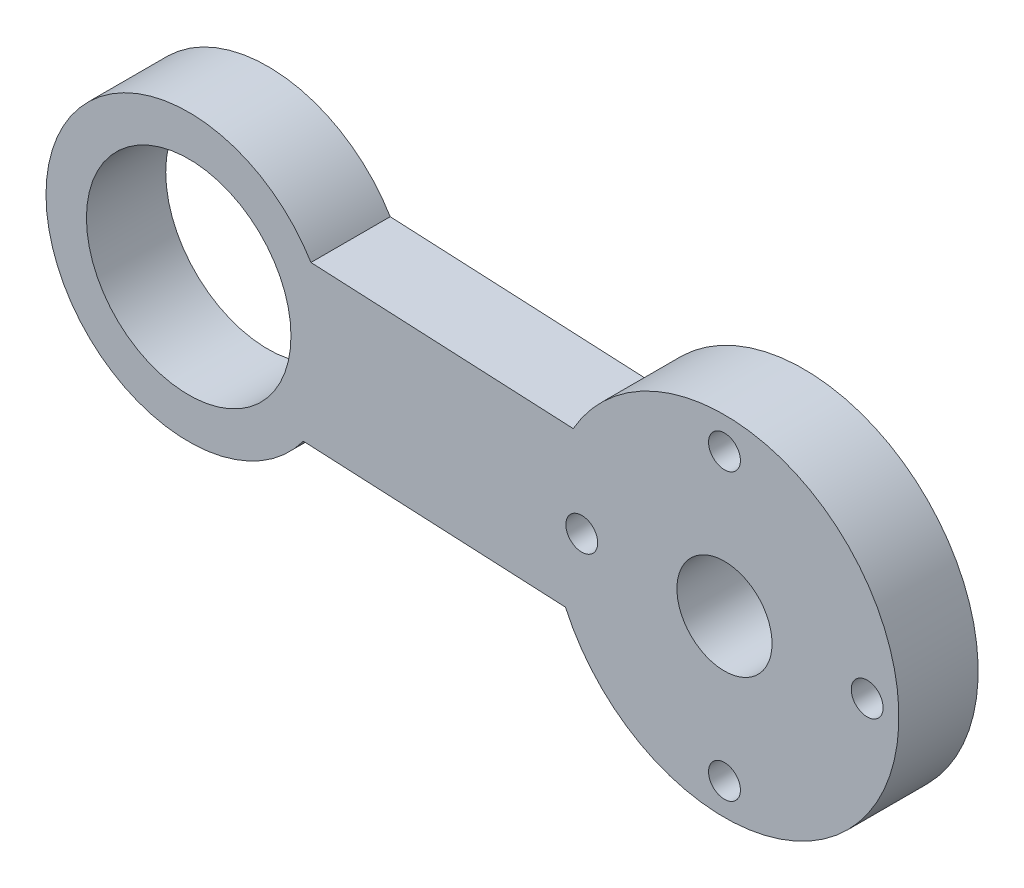
ISO-10303-21;
HEADER;
FILE_DESCRIPTION(('STEP AP214'),'2;1');
FILE_NAME('part.step','',(''),(''),'','','');
FILE_SCHEMA(('AUTOMOTIVE_DESIGN { 1 0 10303 214 1 1 1 1 }'));
ENDSEC;
DATA;
#1=APPLICATION_CONTEXT('core data for automotive mechanical design processes');
#2=APPLICATION_PROTOCOL_DEFINITION('international standard','automotive_design',2000,#1);
#3=PRODUCT_CONTEXT('',#1,'mechanical');
#4=PRODUCT('Part','Part','',(#3));
#5=PRODUCT_RELATED_PRODUCT_CATEGORY('part','',(#4));
#6=PRODUCT_DEFINITION_FORMATION('','',#4);
#7=PRODUCT_DEFINITION_CONTEXT('part definition',#1,'design');
#8=PRODUCT_DEFINITION('design','',#6,#7);
#9=PRODUCT_DEFINITION_SHAPE('','',#8);
#10=(LENGTH_UNIT() NAMED_UNIT(*) SI_UNIT(.MILLI.,.METRE.));
#11=(NAMED_UNIT(*) PLANE_ANGLE_UNIT() SI_UNIT($,.RADIAN.));
#12=(NAMED_UNIT(*) SI_UNIT($,.STERADIAN.) SOLID_ANGLE_UNIT());
#13=UNCERTAINTY_MEASURE_WITH_UNIT(LENGTH_MEASURE(1.E-05),#10,'distance_accuracy_value','');
#14=(GEOMETRIC_REPRESENTATION_CONTEXT(3) GLOBAL_UNCERTAINTY_ASSIGNED_CONTEXT((#13)) GLOBAL_UNIT_ASSIGNED_CONTEXT((#10,
#11,#12)) REPRESENTATION_CONTEXT('',''));
#15=CARTESIAN_POINT('',(0.,0.,0.));
#16=DIRECTION('',(0.,0.,1.));
#17=DIRECTION('',(1.,0.,0.));
#18=AXIS2_PLACEMENT_3D('',#15,#16,#17);
#19=CARTESIAN_POINT('',(0.,0.,5.));
#20=DIRECTION('',(0.,0.,-1.));
#21=DIRECTION('',(-1.,0.,0.));
#22=AXIS2_PLACEMENT_3D('',#19,#20,#21);
#23=CYLINDRICAL_SURFACE('',#22,11.);
#24=CARTESIAN_POINT('',(0.,0.,0.));
#25=DIRECTION('',(0.,0.,1.));
#26=DIRECTION('',(1.,0.,0.));
#27=AXIS2_PLACEMENT_3D('',#24,#25,#26);
#28=CIRCLE('',#27,11.);
#29=CARTESIAN_POINT('',(-10.02588736957,-4.52565823419065,0.));
#30=VERTEX_POINT('',#29);
#31=CARTESIAN_POINT('',(-9.54104722926762,5.47434176580936,0.));
#32=VERTEX_POINT('',#31);
#33=EDGE_CURVE('E82',#30,#32,#28,.T.);
#34=ORIENTED_EDGE('',*,*,#33,.T.);
#35=DIRECTION('',(0.,0.,-1.));
#36=VECTOR('',#35,1.);
#37=CARTESIAN_POINT('',(-9.54104722926762,5.47434176580936,5.));
#38=LINE('',#37,#36);
#39=CARTESIAN_POINT('',(-9.54104722926762,5.47434176580936,5.));
#40=VERTEX_POINT('',#39);
#41=EDGE_CURVE('E11',#40,#32,#38,.T.);
#42=ORIENTED_EDGE('',*,*,#41,.F.);
#43=CARTESIAN_POINT('',(0.,0.,5.));
#44=DIRECTION('',(0.,0.,1.));
#45=DIRECTION('',(1.,0.,0.));
#46=AXIS2_PLACEMENT_3D('',#43,#44,#45);
#47=CIRCLE('',#46,11.);
#48=CARTESIAN_POINT('',(-10.02588736957,-4.52565823419065,5.));
#49=VERTEX_POINT('',#48);
#50=EDGE_CURVE('E84',#49,#40,#47,.T.);
#51=ORIENTED_EDGE('',*,*,#50,.F.);
#52=DIRECTION('',(0.,0.,-1.));
#53=VECTOR('',#52,1.);
#54=CARTESIAN_POINT('',(-10.02588736957,-4.52565823419065,5.));
#55=LINE('',#54,#53);
#56=EDGE_CURVE('E41',#49,#30,#55,.T.);
#57=ORIENTED_EDGE('',*,*,#56,.T.);
#58=EDGE_LOOP('',(#34,#42,#51,#57));
#59=FACE_BOUND('',#58,.T.);
#60=ADVANCED_FACE('F33',(#59),#23,.T.);
#61=CARTESIAN_POINT('',(-9.54104722926762,5.47434176580936,5.));
#62=DIRECTION('',(-0.0484345394381607,-0.998826358978083,0.));
#63=DIRECTION('',(0.998826358978083,-0.0484345394381607,0.));
#64=AXIS2_PLACEMENT_3D('',#61,#62,#63);
#65=PLANE('',#64);
#66=DIRECTION('',(-0.998826358978083,0.0484345394381607,0.));
#67=VECTOR('',#66,1.);
#68=CARTESIAN_POINT('',(-9.54104722926762,5.47434176580936,0.));
#69=LINE('',#68,#67);
#70=CARTESIAN_POINT('',(-26.0813725342701,6.276406139766,0.));
#71=VERTEX_POINT('',#70);
#72=EDGE_CURVE('E85',#32,#71,#69,.T.);
#73=ORIENTED_EDGE('',*,*,#72,.T.);
#74=DIRECTION('',(0.,0.,-1.));
#75=VECTOR('',#74,1.);
#76=CARTESIAN_POINT('',(-26.0813725342701,6.276406139766,5.));
#77=LINE('',#76,#75);
#78=CARTESIAN_POINT('',(-26.0813725342701,6.276406139766,5.));
#79=VERTEX_POINT('',#78);
#80=EDGE_CURVE('E57',#71,#79,#77,.F.);
#81=ORIENTED_EDGE('',*,*,#80,.T.);
#82=DIRECTION('',(-0.998826358978083,0.0484345394381607,0.));
#83=VECTOR('',#82,1.);
#84=CARTESIAN_POINT('',(-9.54104722926762,5.47434176580936,5.));
#85=LINE('',#84,#83);
#86=EDGE_CURVE('E124',#40,#79,#85,.T.);
#87=ORIENTED_EDGE('',*,*,#86,.F.);
#88=ORIENTED_EDGE('',*,*,#41,.T.);
#89=EDGE_LOOP('',(#73,#81,#87,#88));
#90=FACE_BOUND('',#89,.T.);
#91=ADVANCED_FACE('F156',(#90),#65,.F.);
#92=CARTESIAN_POINT('',(-10.02588736957,-4.52565823419065,5.));
#93=DIRECTION('',(0.0484345394381608,0.998826358978083,0.));
#94=DIRECTION('',(-0.998826358978083,0.0484345394381608,0.));
#95=AXIS2_PLACEMENT_3D('',#92,#93,#94);
#96=PLANE('',#95);
#97=DIRECTION('',(0.998826358978083,-0.0484345394381608,0.));
#98=VECTOR('',#97,1.);
#99=CARTESIAN_POINT('',(-10.02588736957,-4.52565823419065,5.));
#100=LINE('',#99,#98);
#101=CARTESIAN_POINT('',(-26.5584342212489,-3.72397104872215,5.));
#102=VERTEX_POINT('',#101);
#103=EDGE_CURVE('E49',#102,#49,#100,.T.);
#104=ORIENTED_EDGE('',*,*,#103,.F.);
#105=DIRECTION('',(0.,0.,-1.));
#106=VECTOR('',#105,1.);
#107=CARTESIAN_POINT('',(-26.5584342212489,-3.72397104872215,5.));
#108=LINE('',#107,#106);
#109=CARTESIAN_POINT('',(-26.5584342212489,-3.72397104872215,0.));
#110=VERTEX_POINT('',#109);
#111=EDGE_CURVE('E87',#102,#110,#108,.T.);
#112=ORIENTED_EDGE('',*,*,#111,.T.);
#113=DIRECTION('',(0.998826358978083,-0.0484345394381608,0.));
#114=VECTOR('',#113,1.);
#115=CARTESIAN_POINT('',(-10.02588736957,-4.52565823419065,0.));
#116=LINE('',#115,#114);
#117=EDGE_CURVE('E76',#110,#30,#116,.T.);
#118=ORIENTED_EDGE('',*,*,#117,.T.);
#119=ORIENTED_EDGE('',*,*,#56,.F.);
#120=EDGE_LOOP('',(#104,#112,#118,#119));
#121=FACE_BOUND('',#120,.T.);
#122=ADVANCED_FACE('F88',(#121),#96,.F.);
#123=CARTESIAN_POINT('',(0.,0.,5.));
#124=DIRECTION('',(0.,0.,1.));
#125=DIRECTION('',(1.,0.,0.));
#126=AXIS2_PLACEMENT_3D('',#123,#124,#125);
#127=PLANE('',#126);
#128=CARTESIAN_POINT('',(-33.7907935724079,1.63261165069584,5.));
#129=DIRECTION('',(0.,0.,1.));
#130=DIRECTION('',(1.,0.,0.));
#131=AXIS2_PLACEMENT_3D('',#128,#129,#130);
#132=CIRCLE('',#131,6.45);
#133=CARTESIAN_POINT('',(-27.3407935724079,1.63261165069584,5.));
#134=VERTEX_POINT('',#133);
#135=EDGE_CURVE('E95',#134,#134,#132,.T.);
#136=ORIENTED_EDGE('',*,*,#135,.F.);
#137=EDGE_LOOP('',(#136));
#138=FACE_BOUND('',#137,.T.);
#139=ORIENTED_EDGE('',*,*,#86,.T.);
#140=CARTESIAN_POINT('',(-33.7907935724079,1.63261165069584,5.));
#141=DIRECTION('',(0.,0.,-1.));
#142=DIRECTION('',(-1.,0.,0.));
#143=AXIS2_PLACEMENT_3D('',#140,#141,#142);
#144=CIRCLE('',#143,9.);
#145=EDGE_CURVE('E92',#102,#79,#144,.T.);
#146=ORIENTED_EDGE('',*,*,#145,.F.);
#147=ORIENTED_EDGE('',*,*,#103,.T.);
#148=ORIENTED_EDGE('',*,*,#50,.T.);
#149=EDGE_LOOP('',(#139,#146,#147,#148));
#150=FACE_BOUND('',#149,.T.);
#151=CARTESIAN_POINT('',(0.,0.,5.));
#152=DIRECTION('',(0.,0.,1.));
#153=DIRECTION('',(1.,0.,0.));
#154=AXIS2_PLACEMENT_3D('',#151,#152,#153);
#155=CIRCLE('',#154,3.);
#156=CARTESIAN_POINT('',(3.,0.,5.));
#157=VERTEX_POINT('',#156);
#158=EDGE_CURVE('E103',#157,#157,#155,.T.);
#159=ORIENTED_EDGE('',*,*,#158,.F.);
#160=EDGE_LOOP('',(#159));
#161=FACE_BOUND('',#160,.T.);
#162=CARTESIAN_POINT('',(-9.,0.,5.));
#163=DIRECTION('',(0.,0.,1.));
#164=DIRECTION('',(1.,0.,0.));
#165=AXIS2_PLACEMENT_3D('',#162,#163,#164);
#166=CIRCLE('',#165,1.005);
#167=CARTESIAN_POINT('',(-7.995,0.,5.));
#168=VERTEX_POINT('',#167);
#169=EDGE_CURVE('E106',#168,#168,#166,.T.);
#170=ORIENTED_EDGE('',*,*,#169,.F.);
#171=EDGE_LOOP('',(#170));
#172=FACE_BOUND('',#171,.T.);
#173=CARTESIAN_POINT('',(0.,-9.,5.));
#174=DIRECTION('',(0.,0.,1.));
#175=DIRECTION('',(1.,0.,0.));
#176=AXIS2_PLACEMENT_3D('',#173,#174,#175);
#177=CIRCLE('',#176,1.005);
#178=CARTESIAN_POINT('',(1.005,-9.,5.));
#179=VERTEX_POINT('',#178);
#180=EDGE_CURVE('E110',#179,#179,#177,.T.);
#181=ORIENTED_EDGE('',*,*,#180,.F.);
#182=EDGE_LOOP('',(#181));
#183=FACE_BOUND('',#182,.T.);
#184=CARTESIAN_POINT('',(9.,0.,5.));
#185=DIRECTION('',(0.,0.,1.));
#186=DIRECTION('',(1.,0.,0.));
#187=AXIS2_PLACEMENT_3D('',#184,#185,#186);
#188=CIRCLE('',#187,1.005);
#189=CARTESIAN_POINT('',(10.005,0.,5.));
#190=VERTEX_POINT('',#189);
#191=EDGE_CURVE('E114',#190,#190,#188,.T.);
#192=ORIENTED_EDGE('',*,*,#191,.F.);
#193=EDGE_LOOP('',(#192));
#194=FACE_BOUND('',#193,.T.);
#195=CARTESIAN_POINT('',(0.,9.,5.));
#196=DIRECTION('',(0.,0.,1.));
#197=DIRECTION('',(1.,0.,0.));
#198=AXIS2_PLACEMENT_3D('',#195,#196,#197);
#199=CIRCLE('',#198,1.005);
#200=CARTESIAN_POINT('',(1.005,9.,5.));
#201=VERTEX_POINT('',#200);
#202=EDGE_CURVE('E118',#201,#201,#199,.T.);
#203=ORIENTED_EDGE('',*,*,#202,.F.);
#204=EDGE_LOOP('',(#203));
#205=FACE_BOUND('',#204,.T.);
#206=ADVANCED_FACE('F164',(#138,#150,#161,#172,#183,#194,#205),#127,.T.);
#207=CARTESIAN_POINT('',(0.,0.,0.));
#208=DIRECTION('',(0.,0.,1.));
#209=DIRECTION('',(1.,0.,0.));
#210=AXIS2_PLACEMENT_3D('',#207,#208,#209);
#211=PLANE('',#210);
#212=CARTESIAN_POINT('',(-33.7907935724079,1.63261165069584,0.));
#213=DIRECTION('',(0.,0.,-1.));
#214=DIRECTION('',(-1.,0.,0.));
#215=AXIS2_PLACEMENT_3D('',#212,#213,#214);
#216=CIRCLE('',#215,6.45);
#217=CARTESIAN_POINT('',(-40.2407935724079,1.63261165069584,0.));
#218=VERTEX_POINT('',#217);
#219=EDGE_CURVE('E99',#218,#218,#216,.T.);
#220=ORIENTED_EDGE('',*,*,#219,.F.);
#221=EDGE_LOOP('',(#220));
#222=FACE_BOUND('',#221,.T.);
#223=CARTESIAN_POINT('',(-33.7907935724079,1.63261165069584,0.));
#224=DIRECTION('',(0.,0.,-1.));
#225=DIRECTION('',(-1.,0.,0.));
#226=AXIS2_PLACEMENT_3D('',#223,#224,#225);
#227=CIRCLE('',#226,9.);
#228=EDGE_CURVE('E80',#110,#71,#227,.T.);
#229=ORIENTED_EDGE('',*,*,#228,.T.);
#230=ORIENTED_EDGE('',*,*,#72,.F.);
#231=ORIENTED_EDGE('',*,*,#33,.F.);
#232=ORIENTED_EDGE('',*,*,#117,.F.);
#233=EDGE_LOOP('',(#229,#230,#231,#232));
#234=FACE_BOUND('',#233,.T.);
#235=CARTESIAN_POINT('',(0.,0.,0.));
#236=DIRECTION('',(0.,0.,1.));
#237=DIRECTION('',(1.,0.,0.));
#238=AXIS2_PLACEMENT_3D('',#235,#236,#237);
#239=CIRCLE('',#238,3.);
#240=CARTESIAN_POINT('',(3.,0.,0.));
#241=VERTEX_POINT('',#240);
#242=EDGE_CURVE('E36',#241,#241,#239,.T.);
#243=ORIENTED_EDGE('',*,*,#242,.T.);
#244=EDGE_LOOP('',(#243));
#245=FACE_BOUND('',#244,.T.);
#246=CARTESIAN_POINT('',(-9.,0.,0.));
#247=DIRECTION('',(0.,0.,1.));
#248=DIRECTION('',(1.,0.,0.));
#249=AXIS2_PLACEMENT_3D('',#246,#247,#248);
#250=CIRCLE('',#249,1.005);
#251=CARTESIAN_POINT('',(-7.995,0.,0.));
#252=VERTEX_POINT('',#251);
#253=EDGE_CURVE('E109',#252,#252,#250,.T.);
#254=ORIENTED_EDGE('',*,*,#253,.T.);
#255=EDGE_LOOP('',(#254));
#256=FACE_BOUND('',#255,.T.);
#257=CARTESIAN_POINT('',(0.,-9.,0.));
#258=DIRECTION('',(0.,0.,1.));
#259=DIRECTION('',(1.,0.,0.));
#260=AXIS2_PLACEMENT_3D('',#257,#258,#259);
#261=CIRCLE('',#260,1.005);
#262=CARTESIAN_POINT('',(1.005,-9.,0.));
#263=VERTEX_POINT('',#262);
#264=EDGE_CURVE('E113',#263,#263,#261,.T.);
#265=ORIENTED_EDGE('',*,*,#264,.T.);
#266=EDGE_LOOP('',(#265));
#267=FACE_BOUND('',#266,.T.);
#268=CARTESIAN_POINT('',(9.,0.,0.));
#269=DIRECTION('',(0.,0.,1.));
#270=DIRECTION('',(1.,0.,0.));
#271=AXIS2_PLACEMENT_3D('',#268,#269,#270);
#272=CIRCLE('',#271,1.005);
#273=CARTESIAN_POINT('',(10.005,0.,0.));
#274=VERTEX_POINT('',#273);
#275=EDGE_CURVE('E117',#274,#274,#272,.T.);
#276=ORIENTED_EDGE('',*,*,#275,.T.);
#277=EDGE_LOOP('',(#276));
#278=FACE_BOUND('',#277,.T.);
#279=CARTESIAN_POINT('',(0.,9.,0.));
#280=DIRECTION('',(0.,0.,1.));
#281=DIRECTION('',(1.,0.,0.));
#282=AXIS2_PLACEMENT_3D('',#279,#280,#281);
#283=CIRCLE('',#282,1.005);
#284=CARTESIAN_POINT('',(1.005,9.,0.));
#285=VERTEX_POINT('',#284);
#286=EDGE_CURVE('E121',#285,#285,#283,.T.);
#287=ORIENTED_EDGE('',*,*,#286,.T.);
#288=EDGE_LOOP('',(#287));
#289=FACE_BOUND('',#288,.T.);
#290=ADVANCED_FACE('F77',(#222,#234,#245,#256,#267,#278,#289),#211,.F.);
#291=CARTESIAN_POINT('',(0.,9.,-1.));
#292=DIRECTION('',(0.,0.,1.));
#293=DIRECTION('',(1.,0.,0.));
#294=AXIS2_PLACEMENT_3D('',#291,#292,#293);
#295=CYLINDRICAL_SURFACE('',#294,1.005);
#296=ORIENTED_EDGE('',*,*,#202,.T.);
#297=EDGE_LOOP('',(#296));
#298=FACE_BOUND('',#297,.T.);
#299=ORIENTED_EDGE('',*,*,#286,.F.);
#300=EDGE_LOOP('',(#299));
#301=FACE_BOUND('',#300,.T.);
#302=ADVANCED_FACE('F179',(#298,#301),#295,.F.);
#303=CARTESIAN_POINT('',(9.,0.,-1.));
#304=DIRECTION('',(0.,0.,1.));
#305=DIRECTION('',(1.,0.,0.));
#306=AXIS2_PLACEMENT_3D('',#303,#304,#305);
#307=CYLINDRICAL_SURFACE('',#306,1.005);
#308=ORIENTED_EDGE('',*,*,#191,.T.);
#309=EDGE_LOOP('',(#308));
#310=FACE_BOUND('',#309,.T.);
#311=ORIENTED_EDGE('',*,*,#275,.F.);
#312=EDGE_LOOP('',(#311));
#313=FACE_BOUND('',#312,.T.);
#314=ADVANCED_FACE('F152',(#310,#313),#307,.F.);
#315=CARTESIAN_POINT('',(0.,-9.,-1.));
#316=DIRECTION('',(0.,0.,1.));
#317=DIRECTION('',(1.,0.,0.));
#318=AXIS2_PLACEMENT_3D('',#315,#316,#317);
#319=CYLINDRICAL_SURFACE('',#318,1.005);
#320=ORIENTED_EDGE('',*,*,#180,.T.);
#321=EDGE_LOOP('',(#320));
#322=FACE_BOUND('',#321,.T.);
#323=ORIENTED_EDGE('',*,*,#264,.F.);
#324=EDGE_LOOP('',(#323));
#325=FACE_BOUND('',#324,.T.);
#326=ADVANCED_FACE('F143',(#322,#325),#319,.F.);
#327=CARTESIAN_POINT('',(-9.,0.,-1.));
#328=DIRECTION('',(0.,0.,1.));
#329=DIRECTION('',(1.,0.,0.));
#330=AXIS2_PLACEMENT_3D('',#327,#328,#329);
#331=CYLINDRICAL_SURFACE('',#330,1.005);
#332=ORIENTED_EDGE('',*,*,#169,.T.);
#333=EDGE_LOOP('',(#332));
#334=FACE_BOUND('',#333,.T.);
#335=ORIENTED_EDGE('',*,*,#253,.F.);
#336=EDGE_LOOP('',(#335));
#337=FACE_BOUND('',#336,.T.);
#338=ADVANCED_FACE('F140',(#334,#337),#331,.F.);
#339=CARTESIAN_POINT('',(0.,0.,-1.));
#340=DIRECTION('',(0.,0.,1.));
#341=DIRECTION('',(1.,0.,0.));
#342=AXIS2_PLACEMENT_3D('',#339,#340,#341);
#343=CYLINDRICAL_SURFACE('',#342,3.);
#344=ORIENTED_EDGE('',*,*,#158,.T.);
#345=EDGE_LOOP('',(#344));
#346=FACE_BOUND('',#345,.T.);
#347=ORIENTED_EDGE('',*,*,#242,.F.);
#348=EDGE_LOOP('',(#347));
#349=FACE_BOUND('',#348,.T.);
#350=ADVANCED_FACE('F142',(#346,#349),#343,.F.);
#351=CARTESIAN_POINT('',(-33.7907935724079,1.63261165069584,5.));
#352=DIRECTION('',(0.,0.,-1.));
#353=DIRECTION('',(-1.,0.,0.));
#354=AXIS2_PLACEMENT_3D('',#351,#352,#353);
#355=CYLINDRICAL_SURFACE('',#354,9.);
#356=ORIENTED_EDGE('',*,*,#80,.F.);
#357=ORIENTED_EDGE('',*,*,#228,.F.);
#358=ORIENTED_EDGE('',*,*,#111,.F.);
#359=ORIENTED_EDGE('',*,*,#145,.T.);
#360=EDGE_LOOP('',(#356,#357,#358,#359));
#361=FACE_BOUND('',#360,.T.);
#362=ADVANCED_FACE('F94',(#361),#355,.T.);
#363=CARTESIAN_POINT('',(-33.7907935724079,1.63261165069584,6.));
#364=DIRECTION('',(0.,0.,-1.));
#365=DIRECTION('',(-1.,0.,0.));
#366=AXIS2_PLACEMENT_3D('',#363,#364,#365);
#367=CYLINDRICAL_SURFACE('',#366,6.45);
#368=ORIENTED_EDGE('',*,*,#135,.T.);
#369=EDGE_LOOP('',(#368));
#370=FACE_BOUND('',#369,.T.);
#371=ORIENTED_EDGE('',*,*,#219,.T.);
#372=EDGE_LOOP('',(#371));
#373=FACE_BOUND('',#372,.T.);
#374=ADVANCED_FACE('F217',(#370,#373),#367,.F.);
#375=CLOSED_SHELL('',(#60,#91,#122,#206,#290,#302,#314,#326,#338,#350,#362,#374));
#376=MANIFOLD_SOLID_BREP('B2',#375);
#377=ADVANCED_BREP_SHAPE_REPRESENTATION('',(#18,#376),#14);
#378=SHAPE_DEFINITION_REPRESENTATION(#9,#377);
ENDSEC;
END-ISO-10303-21;
